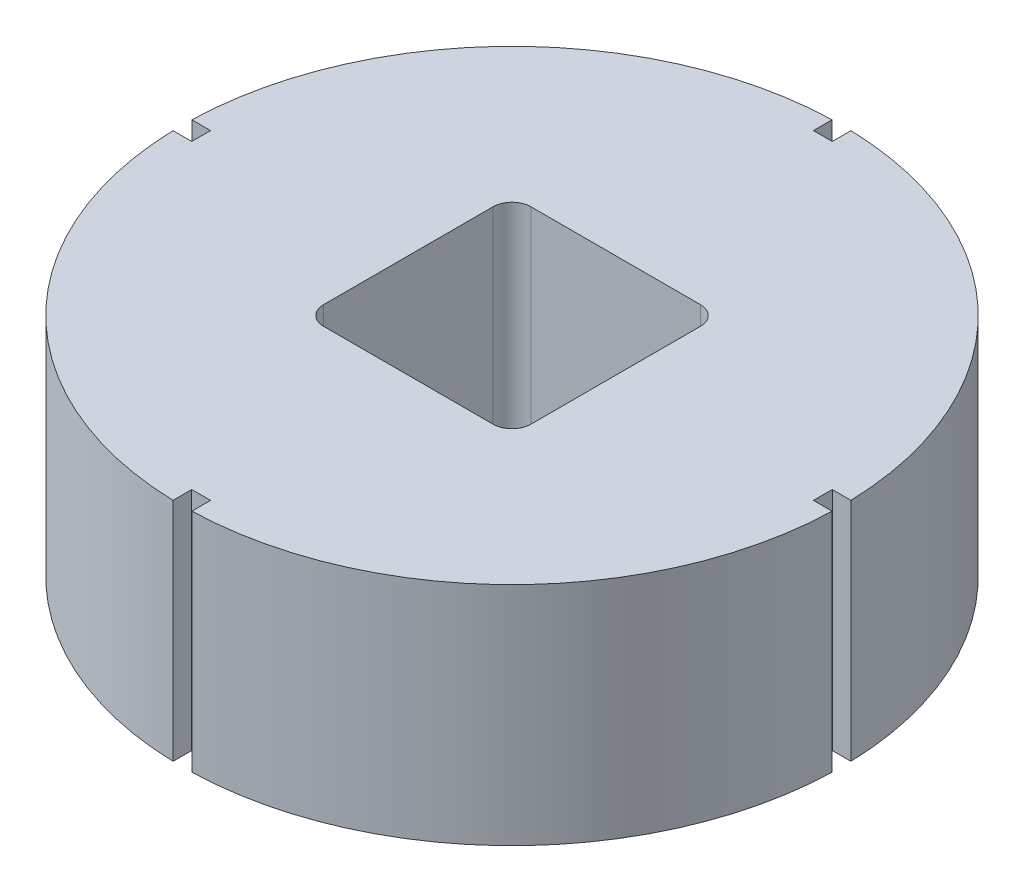
ISO-10303-21;
HEADER;
FILE_DESCRIPTION(('STEP AP214'),'2;1');
FILE_NAME('part.step','',(''),(''),'','','');
FILE_SCHEMA(('AUTOMOTIVE_DESIGN { 1 0 10303 214 1 1 1 1 }'));
ENDSEC;
DATA;
#1=APPLICATION_CONTEXT('core data for automotive mechanical design processes');
#2=APPLICATION_PROTOCOL_DEFINITION('international standard','automotive_design',2000,#1);
#3=PRODUCT_CONTEXT('',#1,'mechanical');
#4=PRODUCT('Part','Part','',(#3));
#5=PRODUCT_RELATED_PRODUCT_CATEGORY('part','',(#4));
#6=PRODUCT_DEFINITION_FORMATION('','',#4);
#7=PRODUCT_DEFINITION_CONTEXT('part definition',#1,'design');
#8=PRODUCT_DEFINITION('design','',#6,#7);
#9=PRODUCT_DEFINITION_SHAPE('','',#8);
#10=(LENGTH_UNIT() NAMED_UNIT(*) SI_UNIT(.MILLI.,.METRE.));
#11=(NAMED_UNIT(*) PLANE_ANGLE_UNIT() SI_UNIT($,.RADIAN.));
#12=(NAMED_UNIT(*) SI_UNIT($,.STERADIAN.) SOLID_ANGLE_UNIT());
#13=UNCERTAINTY_MEASURE_WITH_UNIT(LENGTH_MEASURE(1.E-05),#10,'distance_accuracy_value','');
#14=(GEOMETRIC_REPRESENTATION_CONTEXT(3) GLOBAL_UNCERTAINTY_ASSIGNED_CONTEXT((#13)) GLOBAL_UNIT_ASSIGNED_CONTEXT((#10,
#11,#12)) REPRESENTATION_CONTEXT('',''));
#15=CARTESIAN_POINT('',(0.,0.,0.));
#16=DIRECTION('',(0.,0.,1.));
#17=DIRECTION('',(1.,0.,0.));
#18=AXIS2_PLACEMENT_3D('',#15,#16,#17);
#19=CARTESIAN_POINT('',(0.,24.,0.));
#20=DIRECTION('',(0.,-1.,0.));
#21=DIRECTION('',(0.,0.,-1.));
#22=AXIS2_PLACEMENT_3D('',#19,#20,#21);
#23=CYLINDRICAL_SURFACE('',#22,35.);
#24=CARTESIAN_POINT('',(0.,0.,0.));
#25=DIRECTION('',(0.,1.,0.));
#26=DIRECTION('',(0.,0.,1.));
#27=AXIS2_PLACEMENT_3D('',#24,#25,#26);
#28=CIRCLE('',#27,35.);
#29=CARTESIAN_POINT('',(34.9857113690718,0.,-1.));
#30=VERTEX_POINT('',#29);
#31=CARTESIAN_POINT('',(1.,0.,-34.9857113690718));
#32=VERTEX_POINT('',#31);
#33=EDGE_CURVE('E454',#30,#32,#28,.T.);
#34=ORIENTED_EDGE('',*,*,#33,.T.);
#35=DIRECTION('',(0.,1.,0.));
#36=VECTOR('',#35,1.);
#37=CARTESIAN_POINT('',(1.,-12.,-34.9857113690718));
#38=LINE('',#37,#36);
#39=CARTESIAN_POINT('',(1.,24.,-34.9857113690718));
#40=VERTEX_POINT('',#39);
#41=EDGE_CURVE('E317',#32,#40,#38,.T.);
#42=ORIENTED_EDGE('',*,*,#41,.T.);
#43=CARTESIAN_POINT('',(0.,24.,0.));
#44=DIRECTION('',(0.,1.,0.));
#45=DIRECTION('',(0.,0.,1.));
#46=AXIS2_PLACEMENT_3D('',#43,#44,#45);
#47=CIRCLE('',#46,35.);
#48=CARTESIAN_POINT('',(34.9857113690718,24.,-1.));
#49=VERTEX_POINT('',#48);
#50=EDGE_CURVE('E227',#49,#40,#47,.T.);
#51=ORIENTED_EDGE('',*,*,#50,.F.);
#52=DIRECTION('',(0.,1.,0.));
#53=VECTOR('',#52,1.);
#54=CARTESIAN_POINT('',(34.9857113690718,-12.,-1.));
#55=LINE('',#54,#53);
#56=EDGE_CURVE('E333',#30,#49,#55,.T.);
#57=ORIENTED_EDGE('',*,*,#56,.F.);
#58=EDGE_LOOP('',(#34,#42,#51,#57));
#59=FACE_BOUND('',#58,.T.);
#60=ADVANCED_FACE('F41',(#59),#23,.T.);
#61=CARTESIAN_POINT('',(1.00000000000001,0.,34.9857113690718));
#62=VERTEX_POINT('',#61);
#63=CARTESIAN_POINT('',(34.9857113690718,0.,0.999999999999998));
#64=VERTEX_POINT('',#63);
#65=EDGE_CURVE('E233',#62,#64,#28,.T.);
#66=ORIENTED_EDGE('',*,*,#65,.T.);
#67=DIRECTION('',(0.,1.,0.));
#68=VECTOR('',#67,1.);
#69=CARTESIAN_POINT('',(34.9857113690718,-12.,0.999999999999998));
#70=LINE('',#69,#68);
#71=CARTESIAN_POINT('',(34.9857113690718,24.,0.999999999999998));
#72=VERTEX_POINT('',#71);
#73=EDGE_CURVE('E222',#64,#72,#70,.T.);
#74=ORIENTED_EDGE('',*,*,#73,.T.);
#75=CARTESIAN_POINT('',(1.00000000000001,24.,34.9857113690718));
#76=VERTEX_POINT('',#75);
#77=EDGE_CURVE('E231',#76,#72,#47,.T.);
#78=ORIENTED_EDGE('',*,*,#77,.F.);
#79=DIRECTION('',(0.,1.,0.));
#80=VECTOR('',#79,1.);
#81=CARTESIAN_POINT('',(1.00000000000001,-12.,34.9857113690718));
#82=LINE('',#81,#80);
#83=EDGE_CURVE('E348',#62,#76,#82,.T.);
#84=ORIENTED_EDGE('',*,*,#83,.F.);
#85=EDGE_LOOP('',(#66,#74,#78,#84));
#86=FACE_BOUND('',#85,.T.);
#87=ADVANCED_FACE('F430',(#86),#23,.T.);
#88=CARTESIAN_POINT('',(-34.9857113690718,0.,1.00000000000001));
#89=VERTEX_POINT('',#88);
#90=CARTESIAN_POINT('',(-0.999999999999996,0.,34.9857113690718));
#91=VERTEX_POINT('',#90);
#92=EDGE_CURVE('E320',#89,#91,#28,.T.);
#93=ORIENTED_EDGE('',*,*,#92,.T.);
#94=DIRECTION('',(0.,1.,0.));
#95=VECTOR('',#94,1.);
#96=CARTESIAN_POINT('',(-0.999999999999996,-12.,34.9857113690718));
#97=LINE('',#96,#95);
#98=CARTESIAN_POINT('',(-0.999999999999996,24.,34.9857113690718));
#99=VERTEX_POINT('',#98);
#100=EDGE_CURVE('E328',#91,#99,#97,.T.);
#101=ORIENTED_EDGE('',*,*,#100,.T.);
#102=CARTESIAN_POINT('',(-34.9857113690718,24.,1.00000000000001));
#103=VERTEX_POINT('',#102);
#104=EDGE_CURVE('E228',#103,#99,#47,.T.);
#105=ORIENTED_EDGE('',*,*,#104,.F.);
#106=DIRECTION('',(0.,1.,0.));
#107=VECTOR('',#106,1.);
#108=CARTESIAN_POINT('',(-34.9857113690718,-12.,1.00000000000001));
#109=LINE('',#108,#107);
#110=EDGE_CURVE('E364',#89,#103,#109,.T.);
#111=ORIENTED_EDGE('',*,*,#110,.F.);
#112=EDGE_LOOP('',(#93,#101,#105,#111));
#113=FACE_BOUND('',#112,.T.);
#114=ADVANCED_FACE('F436',(#113),#23,.T.);
#115=CARTESIAN_POINT('',(-1.,24.,-34.9857113690718));
#116=VERTEX_POINT('',#115);
#117=CARTESIAN_POINT('',(-34.9857113690718,24.,-0.999999999999994));
#118=VERTEX_POINT('',#117);
#119=EDGE_CURVE('E219',#116,#118,#47,.T.);
#120=ORIENTED_EDGE('',*,*,#119,.F.);
#121=DIRECTION('',(0.,1.,0.));
#122=VECTOR('',#121,1.);
#123=CARTESIAN_POINT('',(-1.,-12.,-34.9857113690718));
#124=LINE('',#123,#122);
#125=CARTESIAN_POINT('',(-1.,0.,-34.9857113690718));
#126=VERTEX_POINT('',#125);
#127=EDGE_CURVE('E200',#126,#116,#124,.T.);
#128=ORIENTED_EDGE('',*,*,#127,.F.);
#129=CARTESIAN_POINT('',(-34.9857113690718,0.,-0.999999999999994));
#130=VERTEX_POINT('',#129);
#131=EDGE_CURVE('E453',#126,#130,#28,.T.);
#132=ORIENTED_EDGE('',*,*,#131,.T.);
#133=DIRECTION('',(0.,1.,0.));
#134=VECTOR('',#133,1.);
#135=CARTESIAN_POINT('',(-34.9857113690718,-12.,-0.999999999999994));
#136=LINE('',#135,#134);
#137=EDGE_CURVE('E226',#130,#118,#136,.T.);
#138=ORIENTED_EDGE('',*,*,#137,.T.);
#139=EDGE_LOOP('',(#120,#128,#132,#138));
#140=FACE_BOUND('',#139,.T.);
#141=ADVANCED_FACE('F225',(#140),#23,.T.);
#142=CARTESIAN_POINT('',(0.,24.,0.));
#143=DIRECTION('',(0.,1.,0.));
#144=DIRECTION('',(0.,0.,1.));
#145=AXIS2_PLACEMENT_3D('',#142,#143,#144);
#146=PLANE('',#145);
#147=DIRECTION('',(0.,0.,-1.));
#148=VECTOR('',#147,1.);
#149=CARTESIAN_POINT('',(1.,24.,-33.));
#150=LINE('',#149,#148);
#151=CARTESIAN_POINT('',(1.,24.,-33.));
#152=VERTEX_POINT('',#151);
#153=EDGE_CURVE('E211',#152,#40,#150,.T.);
#154=ORIENTED_EDGE('',*,*,#153,.F.);
#155=DIRECTION('',(1.,0.,0.));
#156=VECTOR('',#155,1.);
#157=CARTESIAN_POINT('',(-1.,24.,-33.));
#158=LINE('',#157,#156);
#159=CARTESIAN_POINT('',(-1.,24.,-33.));
#160=VERTEX_POINT('',#159);
#161=EDGE_CURVE('E221',#160,#152,#158,.T.);
#162=ORIENTED_EDGE('',*,*,#161,.F.);
#163=DIRECTION('',(0.,0.,1.));
#164=VECTOR('',#163,1.);
#165=CARTESIAN_POINT('',(-1.,24.,-34.9857113690718));
#166=LINE('',#165,#164);
#167=EDGE_CURVE('E203',#116,#160,#166,.T.);
#168=ORIENTED_EDGE('',*,*,#167,.F.);
#169=ORIENTED_EDGE('',*,*,#119,.T.);
#170=DIRECTION('',(-1.,0.,0.));
#171=VECTOR('',#170,1.);
#172=CARTESIAN_POINT('',(-33.,24.,-0.999999999999994));
#173=LINE('',#172,#171);
#174=CARTESIAN_POINT('',(-33.,24.,-0.999999999999994));
#175=VERTEX_POINT('',#174);
#176=EDGE_CURVE('E362',#175,#118,#173,.T.);
#177=ORIENTED_EDGE('',*,*,#176,.F.);
#178=DIRECTION('',(0.,0.,-1.));
#179=VECTOR('',#178,1.);
#180=CARTESIAN_POINT('',(-33.,24.,1.00000000000001));
#181=LINE('',#180,#179);
#182=CARTESIAN_POINT('',(-33.,24.,1.00000000000001));
#183=VERTEX_POINT('',#182);
#184=EDGE_CURVE('E359',#183,#175,#181,.T.);
#185=ORIENTED_EDGE('',*,*,#184,.F.);
#186=DIRECTION('',(1.,0.,0.));
#187=VECTOR('',#186,1.);
#188=CARTESIAN_POINT('',(-34.9857113690718,24.,1.00000000000001));
#189=LINE('',#188,#187);
#190=EDGE_CURVE('E356',#103,#183,#189,.T.);
#191=ORIENTED_EDGE('',*,*,#190,.F.);
#192=ORIENTED_EDGE('',*,*,#104,.T.);
#193=DIRECTION('',(0.,0.,1.));
#194=VECTOR('',#193,1.);
#195=CARTESIAN_POINT('',(-0.999999999999996,24.,33.));
#196=LINE('',#195,#194);
#197=CARTESIAN_POINT('',(-0.999999999999996,24.,33.));
#198=VERTEX_POINT('',#197);
#199=EDGE_CURVE('E346',#198,#99,#196,.T.);
#200=ORIENTED_EDGE('',*,*,#199,.F.);
#201=DIRECTION('',(-1.,0.,0.));
#202=VECTOR('',#201,1.);
#203=CARTESIAN_POINT('',(1.00000000000001,24.,33.));
#204=LINE('',#203,#202);
#205=CARTESIAN_POINT('',(1.00000000000001,24.,33.));
#206=VERTEX_POINT('',#205);
#207=EDGE_CURVE('E343',#206,#198,#204,.T.);
#208=ORIENTED_EDGE('',*,*,#207,.F.);
#209=DIRECTION('',(0.,0.,-1.));
#210=VECTOR('',#209,1.);
#211=CARTESIAN_POINT('',(1.00000000000001,24.,34.9857113690718));
#212=LINE('',#211,#210);
#213=EDGE_CURVE('E340',#76,#206,#212,.T.);
#214=ORIENTED_EDGE('',*,*,#213,.F.);
#215=ORIENTED_EDGE('',*,*,#77,.T.);
#216=DIRECTION('',(1.,0.,0.));
#217=VECTOR('',#216,1.);
#218=CARTESIAN_POINT('',(33.,24.,0.999999999999998));
#219=LINE('',#218,#217);
#220=CARTESIAN_POINT('',(33.,24.,0.999999999999998));
#221=VERTEX_POINT('',#220);
#222=EDGE_CURVE('E331',#221,#72,#219,.T.);
#223=ORIENTED_EDGE('',*,*,#222,.F.);
#224=DIRECTION('',(0.,0.,1.));
#225=VECTOR('',#224,1.);
#226=CARTESIAN_POINT('',(33.,24.,-1.));
#227=LINE('',#226,#225);
#228=CARTESIAN_POINT('',(33.,24.,-1.));
#229=VERTEX_POINT('',#228);
#230=EDGE_CURVE('E327',#229,#221,#227,.T.);
#231=ORIENTED_EDGE('',*,*,#230,.F.);
#232=DIRECTION('',(-1.,0.,0.));
#233=VECTOR('',#232,1.);
#234=CARTESIAN_POINT('',(34.9857113690718,24.,-1.));
#235=LINE('',#234,#233);
#236=EDGE_CURVE('E325',#49,#229,#235,.T.);
#237=ORIENTED_EDGE('',*,*,#236,.F.);
#238=ORIENTED_EDGE('',*,*,#50,.T.);
#239=EDGE_LOOP('',(#154,#162,#168,#169,#177,#185,#191,#192,#200,#208,#214,#215,#223,#231,#237,#238));
#240=FACE_BOUND('',#239,.T.);
#241=CARTESIAN_POINT('',(-9.,24.,9.));
#242=DIRECTION('',(0.,1.,0.));
#243=DIRECTION('',(0.,0.,1.));
#244=AXIS2_PLACEMENT_3D('',#241,#242,#243);
#245=CIRCLE('',#244,2.);
#246=CARTESIAN_POINT('',(-11.,24.,8.99999999999999));
#247=VERTEX_POINT('',#246);
#248=CARTESIAN_POINT('',(-8.99999999999998,24.,11.));
#249=VERTEX_POINT('',#248);
#250=EDGE_CURVE('E261',#247,#249,#245,.T.);
#251=ORIENTED_EDGE('',*,*,#250,.F.);
#252=DIRECTION('',(0.,0.,1.));
#253=VECTOR('',#252,1.);
#254=CARTESIAN_POINT('',(-11.,24.,-8.99999999999998));
#255=LINE('',#254,#253);
#256=CARTESIAN_POINT('',(-11.,24.,-8.99999999999998));
#257=VERTEX_POINT('',#256);
#258=EDGE_CURVE('E258',#257,#247,#255,.T.);
#259=ORIENTED_EDGE('',*,*,#258,.F.);
#260=CARTESIAN_POINT('',(-9.,24.,-9.));
#261=DIRECTION('',(0.,1.,0.));
#262=DIRECTION('',(0.,0.,1.));
#263=AXIS2_PLACEMENT_3D('',#260,#261,#262);
#264=CIRCLE('',#263,2.);
#265=CARTESIAN_POINT('',(-8.99999999999999,24.,-11.));
#266=VERTEX_POINT('',#265);
#267=EDGE_CURVE('E255',#266,#257,#264,.T.);
#268=ORIENTED_EDGE('',*,*,#267,.F.);
#269=DIRECTION('',(-1.,0.,0.));
#270=VECTOR('',#269,1.);
#271=CARTESIAN_POINT('',(-8.99999999999999,24.,-11.));
#272=LINE('',#271,#270);
#273=CARTESIAN_POINT('',(8.99999999999998,24.,-11.));
#274=VERTEX_POINT('',#273);
#275=EDGE_CURVE('E252',#274,#266,#272,.T.);
#276=ORIENTED_EDGE('',*,*,#275,.F.);
#277=CARTESIAN_POINT('',(9.,24.,-9.));
#278=DIRECTION('',(0.,1.,0.));
#279=DIRECTION('',(0.,0.,-1.));
#280=AXIS2_PLACEMENT_3D('',#277,#278,#279);
#281=CIRCLE('',#280,2.);
#282=CARTESIAN_POINT('',(11.,24.,-8.99999999999998));
#283=VERTEX_POINT('',#282);
#284=EDGE_CURVE('E249',#283,#274,#281,.T.);
#285=ORIENTED_EDGE('',*,*,#284,.F.);
#286=DIRECTION('',(0.,0.,-1.));
#287=VECTOR('',#286,1.);
#288=CARTESIAN_POINT('',(11.,24.,-8.99999999999998));
#289=LINE('',#288,#287);
#290=CARTESIAN_POINT('',(11.,24.,8.99999999999999));
#291=VERTEX_POINT('',#290);
#292=EDGE_CURVE('E246',#291,#283,#289,.T.);
#293=ORIENTED_EDGE('',*,*,#292,.F.);
#294=CARTESIAN_POINT('',(9.,24.,9.));
#295=DIRECTION('',(0.,1.,0.));
#296=DIRECTION('',(0.,0.,1.));
#297=AXIS2_PLACEMENT_3D('',#294,#295,#296);
#298=CIRCLE('',#297,2.);
#299=CARTESIAN_POINT('',(8.99999999999999,24.,11.));
#300=VERTEX_POINT('',#299);
#301=EDGE_CURVE('E243',#300,#291,#298,.T.);
#302=ORIENTED_EDGE('',*,*,#301,.F.);
#303=DIRECTION('',(1.,0.,0.));
#304=VECTOR('',#303,1.);
#305=CARTESIAN_POINT('',(-8.99999999999998,24.,11.));
#306=LINE('',#305,#304);
#307=EDGE_CURVE('E242',#249,#300,#306,.T.);
#308=ORIENTED_EDGE('',*,*,#307,.F.);
#309=EDGE_LOOP('',(#251,#259,#268,#276,#285,#293,#302,#308));
#310=FACE_BOUND('',#309,.T.);
#311=ADVANCED_FACE('F216',(#240,#310),#146,.T.);
#312=CARTESIAN_POINT('',(0.,0.,0.));
#313=DIRECTION('',(0.,1.,0.));
#314=DIRECTION('',(0.,0.,1.));
#315=AXIS2_PLACEMENT_3D('',#312,#313,#314);
#316=PLANE('',#315);
#317=DIRECTION('',(0.,0.,1.));
#318=VECTOR('',#317,1.);
#319=CARTESIAN_POINT('',(-11.,0.,0.));
#320=LINE('',#319,#318);
#321=CARTESIAN_POINT('',(-11.,0.,-8.99999999999998));
#322=VERTEX_POINT('',#321);
#323=CARTESIAN_POINT('',(-11.,0.,8.99999999999999));
#324=VERTEX_POINT('',#323);
#325=EDGE_CURVE('E237',#322,#324,#320,.T.);
#326=ORIENTED_EDGE('',*,*,#325,.T.);
#327=CARTESIAN_POINT('',(-9.,0.,9.));
#328=DIRECTION('',(0.,1.,0.));
#329=DIRECTION('',(0.,0.,1.));
#330=AXIS2_PLACEMENT_3D('',#327,#328,#329);
#331=CIRCLE('',#330,2.);
#332=CARTESIAN_POINT('',(-8.99999999999998,0.,11.));
#333=VERTEX_POINT('',#332);
#334=EDGE_CURVE('E371',#324,#333,#331,.T.);
#335=ORIENTED_EDGE('',*,*,#334,.T.);
#336=DIRECTION('',(1.,0.,0.));
#337=VECTOR('',#336,1.);
#338=CARTESIAN_POINT('',(0.,0.,11.));
#339=LINE('',#338,#337);
#340=CARTESIAN_POINT('',(8.99999999999999,0.,11.));
#341=VERTEX_POINT('',#340);
#342=EDGE_CURVE('E374',#333,#341,#339,.T.);
#343=ORIENTED_EDGE('',*,*,#342,.T.);
#344=CARTESIAN_POINT('',(9.,0.,9.));
#345=DIRECTION('',(0.,1.,0.));
#346=DIRECTION('',(0.,0.,1.));
#347=AXIS2_PLACEMENT_3D('',#344,#345,#346);
#348=CIRCLE('',#347,2.);
#349=CARTESIAN_POINT('',(11.,0.,8.99999999999999));
#350=VERTEX_POINT('',#349);
#351=EDGE_CURVE('E388',#341,#350,#348,.T.);
#352=ORIENTED_EDGE('',*,*,#351,.T.);
#353=DIRECTION('',(0.,0.,-1.));
#354=VECTOR('',#353,1.);
#355=CARTESIAN_POINT('',(11.,0.,0.));
#356=LINE('',#355,#354);
#357=CARTESIAN_POINT('',(11.,0.,-8.99999999999998));
#358=VERTEX_POINT('',#357);
#359=EDGE_CURVE('E385',#350,#358,#356,.T.);
#360=ORIENTED_EDGE('',*,*,#359,.T.);
#361=CARTESIAN_POINT('',(9.,0.,-9.));
#362=DIRECTION('',(0.,1.,0.));
#363=DIRECTION('',(0.,0.,1.));
#364=AXIS2_PLACEMENT_3D('',#361,#362,#363);
#365=CIRCLE('',#364,2.);
#366=CARTESIAN_POINT('',(8.99999999999998,0.,-11.));
#367=VERTEX_POINT('',#366);
#368=EDGE_CURVE('E382',#358,#367,#365,.T.);
#369=ORIENTED_EDGE('',*,*,#368,.T.);
#370=DIRECTION('',(-1.,0.,0.));
#371=VECTOR('',#370,1.);
#372=CARTESIAN_POINT('',(0.,0.,-11.));
#373=LINE('',#372,#371);
#374=CARTESIAN_POINT('',(-8.99999999999999,0.,-11.));
#375=VERTEX_POINT('',#374);
#376=EDGE_CURVE('E379',#367,#375,#373,.T.);
#377=ORIENTED_EDGE('',*,*,#376,.T.);
#378=CARTESIAN_POINT('',(-9.,0.,-9.));
#379=DIRECTION('',(0.,1.,0.));
#380=DIRECTION('',(0.,0.,1.));
#381=AXIS2_PLACEMENT_3D('',#378,#379,#380);
#382=CIRCLE('',#381,2.);
#383=EDGE_CURVE('E264',#375,#322,#382,.T.);
#384=ORIENTED_EDGE('',*,*,#383,.T.);
#385=EDGE_LOOP('',(#326,#335,#343,#352,#360,#369,#377,#384));
#386=FACE_BOUND('',#385,.T.);
#387=DIRECTION('',(1.,0.,0.));
#388=VECTOR('',#387,1.);
#389=CARTESIAN_POINT('',(0.,0.,-33.));
#390=LINE('',#389,#388);
#391=CARTESIAN_POINT('',(-1.,0.,-33.));
#392=VERTEX_POINT('',#391);
#393=CARTESIAN_POINT('',(1.,0.,-33.));
#394=VERTEX_POINT('',#393);
#395=EDGE_CURVE('E49',#392,#394,#390,.T.);
#396=ORIENTED_EDGE('',*,*,#395,.T.);
#397=DIRECTION('',(0.,0.,-1.));
#398=VECTOR('',#397,1.);
#399=CARTESIAN_POINT('',(0.999999999999997,0.,0.));
#400=LINE('',#399,#398);
#401=EDGE_CURVE('E12',#394,#32,#400,.T.);
#402=ORIENTED_EDGE('',*,*,#401,.T.);
#403=ORIENTED_EDGE('',*,*,#33,.F.);
#404=DIRECTION('',(-1.,0.,0.));
#405=VECTOR('',#404,1.);
#406=CARTESIAN_POINT('',(0.,0.,-0.999999999999993));
#407=LINE('',#406,#405);
#408=CARTESIAN_POINT('',(33.,0.,-1.));
#409=VERTEX_POINT('',#408);
#410=EDGE_CURVE('E298',#30,#409,#407,.T.);
#411=ORIENTED_EDGE('',*,*,#410,.T.);
#412=DIRECTION('',(0.,0.,1.));
#413=VECTOR('',#412,1.);
#414=CARTESIAN_POINT('',(33.,0.,0.));
#415=LINE('',#414,#413);
#416=CARTESIAN_POINT('',(33.,0.,0.999999999999998));
#417=VERTEX_POINT('',#416);
#418=EDGE_CURVE('E301',#409,#417,#415,.T.);
#419=ORIENTED_EDGE('',*,*,#418,.T.);
#420=DIRECTION('',(1.,0.,0.));
#421=VECTOR('',#420,1.);
#422=CARTESIAN_POINT('',(0.,0.,0.999999999999998));
#423=LINE('',#422,#421);
#424=EDGE_CURVE('E304',#417,#64,#423,.T.);
#425=ORIENTED_EDGE('',*,*,#424,.T.);
#426=ORIENTED_EDGE('',*,*,#65,.F.);
#427=DIRECTION('',(0.,0.,-1.));
#428=VECTOR('',#427,1.);
#429=CARTESIAN_POINT('',(0.999999999999995,0.,0.));
#430=LINE('',#429,#428);
#431=CARTESIAN_POINT('',(1.00000000000001,0.,33.));
#432=VERTEX_POINT('',#431);
#433=EDGE_CURVE('E289',#62,#432,#430,.T.);
#434=ORIENTED_EDGE('',*,*,#433,.T.);
#435=DIRECTION('',(-1.,0.,0.));
#436=VECTOR('',#435,1.);
#437=CARTESIAN_POINT('',(0.,0.,33.));
#438=LINE('',#437,#436);
#439=CARTESIAN_POINT('',(-0.999999999999996,0.,33.));
#440=VERTEX_POINT('',#439);
#441=EDGE_CURVE('E292',#432,#440,#438,.T.);
#442=ORIENTED_EDGE('',*,*,#441,.T.);
#443=DIRECTION('',(0.,0.,1.));
#444=VECTOR('',#443,1.);
#445=CARTESIAN_POINT('',(-0.999999999999996,0.,0.));
#446=LINE('',#445,#444);
#447=EDGE_CURVE('E295',#440,#91,#446,.T.);
#448=ORIENTED_EDGE('',*,*,#447,.T.);
#449=ORIENTED_EDGE('',*,*,#92,.F.);
#450=DIRECTION('',(1.,0.,0.));
#451=VECTOR('',#450,1.);
#452=CARTESIAN_POINT('',(0.,0.,0.999999999999993));
#453=LINE('',#452,#451);
#454=CARTESIAN_POINT('',(-33.,0.,1.00000000000001));
#455=VERTEX_POINT('',#454);
#456=EDGE_CURVE('E279',#89,#455,#453,.T.);
#457=ORIENTED_EDGE('',*,*,#456,.T.);
#458=DIRECTION('',(0.,0.,-1.));
#459=VECTOR('',#458,1.);
#460=CARTESIAN_POINT('',(-33.,0.,0.));
#461=LINE('',#460,#459);
#462=CARTESIAN_POINT('',(-33.,0.,-0.999999999999994));
#463=VERTEX_POINT('',#462);
#464=EDGE_CURVE('E283',#455,#463,#461,.T.);
#465=ORIENTED_EDGE('',*,*,#464,.T.);
#466=DIRECTION('',(-1.,0.,0.));
#467=VECTOR('',#466,1.);
#468=CARTESIAN_POINT('',(0.,0.,-0.999999999999998));
#469=LINE('',#468,#467);
#470=EDGE_CURVE('E286',#463,#130,#469,.T.);
#471=ORIENTED_EDGE('',*,*,#470,.T.);
#472=ORIENTED_EDGE('',*,*,#131,.F.);
#473=DIRECTION('',(0.,0.,1.));
#474=VECTOR('',#473,1.);
#475=CARTESIAN_POINT('',(-0.999999999999994,0.,0.));
#476=LINE('',#475,#474);
#477=EDGE_CURVE('E206',#126,#392,#476,.T.);
#478=ORIENTED_EDGE('',*,*,#477,.T.);
#479=EDGE_LOOP('',(#396,#402,#403,#411,#419,#425,#426,#434,#442,#448,#449,#457,#465,#471,#472,#478));
#480=FACE_BOUND('',#479,.T.);
#481=ADVANCED_FACE('F309',(#386,#480),#316,.F.);
#482=CARTESIAN_POINT('',(-9.,-1.,9.));
#483=DIRECTION('',(0.,1.,0.));
#484=DIRECTION('',(0.,0.,1.));
#485=AXIS2_PLACEMENT_3D('',#482,#483,#484);
#486=CYLINDRICAL_SURFACE('',#485,2.);
#487=DIRECTION('',(0.,1.,0.));
#488=VECTOR('',#487,1.);
#489=CARTESIAN_POINT('',(-11.,-1.,8.99999999999999));
#490=LINE('',#489,#488);
#491=EDGE_CURVE('E262',#324,#247,#490,.T.);
#492=ORIENTED_EDGE('',*,*,#491,.T.);
#493=ORIENTED_EDGE('',*,*,#250,.T.);
#494=DIRECTION('',(0.,1.,0.));
#495=VECTOR('',#494,1.);
#496=CARTESIAN_POINT('',(-8.99999999999998,-1.,11.));
#497=LINE('',#496,#495);
#498=EDGE_CURVE('E239',#333,#249,#497,.T.);
#499=ORIENTED_EDGE('',*,*,#498,.F.);
#500=ORIENTED_EDGE('',*,*,#334,.F.);
#501=EDGE_LOOP('',(#492,#493,#499,#500));
#502=FACE_BOUND('',#501,.T.);
#503=ADVANCED_FACE('F398',(#502),#486,.F.);
#504=CARTESIAN_POINT('',(-11.,-1.,-8.99999999999998));
#505=DIRECTION('',(-1.,0.,0.));
#506=DIRECTION('',(0.,0.,1.));
#507=AXIS2_PLACEMENT_3D('',#504,#505,#506);
#508=PLANE('',#507);
#509=DIRECTION('',(0.,1.,0.));
#510=VECTOR('',#509,1.);
#511=CARTESIAN_POINT('',(-11.,-1.,-8.99999999999998));
#512=LINE('',#511,#510);
#513=EDGE_CURVE('E259',#322,#257,#512,.T.);
#514=ORIENTED_EDGE('',*,*,#513,.T.);
#515=ORIENTED_EDGE('',*,*,#258,.T.);
#516=ORIENTED_EDGE('',*,*,#491,.F.);
#517=ORIENTED_EDGE('',*,*,#325,.F.);
#518=EDGE_LOOP('',(#514,#515,#516,#517));
#519=FACE_BOUND('',#518,.T.);
#520=ADVANCED_FACE('F43',(#519),#508,.F.);
#521=CARTESIAN_POINT('',(-9.,-1.,-9.));
#522=DIRECTION('',(0.,1.,0.));
#523=DIRECTION('',(0.,0.,1.));
#524=AXIS2_PLACEMENT_3D('',#521,#522,#523);
#525=CYLINDRICAL_SURFACE('',#524,2.);
#526=DIRECTION('',(0.,1.,0.));
#527=VECTOR('',#526,1.);
#528=CARTESIAN_POINT('',(-8.99999999999999,-1.,-11.));
#529=LINE('',#528,#527);
#530=EDGE_CURVE('E256',#375,#266,#529,.T.);
#531=ORIENTED_EDGE('',*,*,#530,.T.);
#532=ORIENTED_EDGE('',*,*,#267,.T.);
#533=ORIENTED_EDGE('',*,*,#513,.F.);
#534=ORIENTED_EDGE('',*,*,#383,.F.);
#535=EDGE_LOOP('',(#531,#532,#533,#534));
#536=FACE_BOUND('',#535,.T.);
#537=ADVANCED_FACE('F420',(#536),#525,.F.);
#538=CARTESIAN_POINT('',(-8.99999999999999,-1.,-11.));
#539=DIRECTION('',(0.,0.,-1.));
#540=DIRECTION('',(-1.,0.,0.));
#541=AXIS2_PLACEMENT_3D('',#538,#539,#540);
#542=PLANE('',#541);
#543=DIRECTION('',(0.,1.,0.));
#544=VECTOR('',#543,1.);
#545=CARTESIAN_POINT('',(8.99999999999998,-1.,-11.));
#546=LINE('',#545,#544);
#547=EDGE_CURVE('E253',#367,#274,#546,.T.);
#548=ORIENTED_EDGE('',*,*,#547,.T.);
#549=ORIENTED_EDGE('',*,*,#275,.T.);
#550=ORIENTED_EDGE('',*,*,#530,.F.);
#551=ORIENTED_EDGE('',*,*,#376,.F.);
#552=EDGE_LOOP('',(#548,#549,#550,#551));
#553=FACE_BOUND('',#552,.T.);
#554=ADVANCED_FACE('F417',(#553),#542,.F.);
#555=CARTESIAN_POINT('',(9.,-1.,-9.));
#556=DIRECTION('',(0.,1.,0.));
#557=DIRECTION('',(0.,0.,1.));
#558=AXIS2_PLACEMENT_3D('',#555,#556,#557);
#559=CYLINDRICAL_SURFACE('',#558,2.);
#560=DIRECTION('',(0.,1.,0.));
#561=VECTOR('',#560,1.);
#562=CARTESIAN_POINT('',(11.,-1.,-8.99999999999998));
#563=LINE('',#562,#561);
#564=EDGE_CURVE('E250',#358,#283,#563,.T.);
#565=ORIENTED_EDGE('',*,*,#564,.T.);
#566=ORIENTED_EDGE('',*,*,#284,.T.);
#567=ORIENTED_EDGE('',*,*,#547,.F.);
#568=ORIENTED_EDGE('',*,*,#368,.F.);
#569=EDGE_LOOP('',(#565,#566,#567,#568));
#570=FACE_BOUND('',#569,.T.);
#571=ADVANCED_FACE('F414',(#570),#559,.F.);
#572=CARTESIAN_POINT('',(11.,-1.,-8.99999999999998));
#573=DIRECTION('',(1.,0.,0.));
#574=DIRECTION('',(0.,0.,-1.));
#575=AXIS2_PLACEMENT_3D('',#572,#573,#574);
#576=PLANE('',#575);
#577=DIRECTION('',(0.,1.,0.));
#578=VECTOR('',#577,1.);
#579=CARTESIAN_POINT('',(11.,-1.,8.99999999999999));
#580=LINE('',#579,#578);
#581=EDGE_CURVE('E247',#350,#291,#580,.T.);
#582=ORIENTED_EDGE('',*,*,#581,.T.);
#583=ORIENTED_EDGE('',*,*,#292,.T.);
#584=ORIENTED_EDGE('',*,*,#564,.F.);
#585=ORIENTED_EDGE('',*,*,#359,.F.);
#586=EDGE_LOOP('',(#582,#583,#584,#585));
#587=FACE_BOUND('',#586,.T.);
#588=ADVANCED_FACE('F410',(#587),#576,.F.);
#589=CARTESIAN_POINT('',(9.,-1.,9.));
#590=DIRECTION('',(0.,1.,0.));
#591=DIRECTION('',(0.,0.,1.));
#592=AXIS2_PLACEMENT_3D('',#589,#590,#591);
#593=CYLINDRICAL_SURFACE('',#592,2.);
#594=DIRECTION('',(0.,1.,0.));
#595=VECTOR('',#594,1.);
#596=CARTESIAN_POINT('',(8.99999999999999,-1.,11.));
#597=LINE('',#596,#595);
#598=EDGE_CURVE('E244',#341,#300,#597,.T.);
#599=ORIENTED_EDGE('',*,*,#598,.T.);
#600=ORIENTED_EDGE('',*,*,#301,.T.);
#601=ORIENTED_EDGE('',*,*,#581,.F.);
#602=ORIENTED_EDGE('',*,*,#351,.F.);
#603=EDGE_LOOP('',(#599,#600,#601,#602));
#604=FACE_BOUND('',#603,.T.);
#605=ADVANCED_FACE('F408',(#604),#593,.F.);
#606=CARTESIAN_POINT('',(-8.99999999999998,-1.,11.));
#607=DIRECTION('',(0.,0.,1.));
#608=DIRECTION('',(1.,0.,0.));
#609=AXIS2_PLACEMENT_3D('',#606,#607,#608);
#610=PLANE('',#609);
#611=ORIENTED_EDGE('',*,*,#498,.T.);
#612=ORIENTED_EDGE('',*,*,#307,.T.);
#613=ORIENTED_EDGE('',*,*,#598,.F.);
#614=ORIENTED_EDGE('',*,*,#342,.F.);
#615=EDGE_LOOP('',(#611,#612,#613,#614));
#616=FACE_BOUND('',#615,.T.);
#617=ADVANCED_FACE('F395',(#616),#610,.F.);
#618=CARTESIAN_POINT('',(-33.,-12.,-0.999999999999994));
#619=DIRECTION('',(0.,0.,-1.));
#620=DIRECTION('',(-1.,0.,0.));
#621=AXIS2_PLACEMENT_3D('',#618,#619,#620);
#622=PLANE('',#621);
#623=DIRECTION('',(0.,1.,0.));
#624=VECTOR('',#623,1.);
#625=CARTESIAN_POINT('',(-33.,-12.,-0.999999999999994));
#626=LINE('',#625,#624);
#627=EDGE_CURVE('E366',#463,#175,#626,.T.);
#628=ORIENTED_EDGE('',*,*,#627,.T.);
#629=ORIENTED_EDGE('',*,*,#176,.T.);
#630=ORIENTED_EDGE('',*,*,#137,.F.);
#631=ORIENTED_EDGE('',*,*,#470,.F.);
#632=EDGE_LOOP('',(#628,#629,#630,#631));
#633=FACE_BOUND('',#632,.T.);
#634=ADVANCED_FACE('F496',(#633),#622,.F.);
#635=CARTESIAN_POINT('',(-33.,-12.,1.00000000000001));
#636=DIRECTION('',(1.,0.,0.));
#637=DIRECTION('',(0.,0.,-1.));
#638=AXIS2_PLACEMENT_3D('',#635,#636,#637);
#639=PLANE('',#638);
#640=DIRECTION('',(0.,1.,0.));
#641=VECTOR('',#640,1.);
#642=CARTESIAN_POINT('',(-33.,-12.,1.00000000000001));
#643=LINE('',#642,#641);
#644=EDGE_CURVE('E368',#455,#183,#643,.T.);
#645=ORIENTED_EDGE('',*,*,#644,.T.);
#646=ORIENTED_EDGE('',*,*,#184,.T.);
#647=ORIENTED_EDGE('',*,*,#627,.F.);
#648=ORIENTED_EDGE('',*,*,#464,.F.);
#649=EDGE_LOOP('',(#645,#646,#647,#648));
#650=FACE_BOUND('',#649,.T.);
#651=ADVANCED_FACE('F489',(#650),#639,.F.);
#652=CARTESIAN_POINT('',(-34.9857113690718,-12.,1.00000000000001));
#653=DIRECTION('',(0.,0.,1.));
#654=DIRECTION('',(1.,0.,0.));
#655=AXIS2_PLACEMENT_3D('',#652,#653,#654);
#656=PLANE('',#655);
#657=ORIENTED_EDGE('',*,*,#110,.T.);
#658=ORIENTED_EDGE('',*,*,#190,.T.);
#659=ORIENTED_EDGE('',*,*,#644,.F.);
#660=ORIENTED_EDGE('',*,*,#456,.F.);
#661=EDGE_LOOP('',(#657,#658,#659,#660));
#662=FACE_BOUND('',#661,.T.);
#663=ADVANCED_FACE('F482',(#662),#656,.F.);
#664=CARTESIAN_POINT('',(-0.999999999999996,-12.,33.));
#665=DIRECTION('',(-1.,0.,0.));
#666=DIRECTION('',(0.,0.,1.));
#667=AXIS2_PLACEMENT_3D('',#664,#665,#666);
#668=PLANE('',#667);
#669=DIRECTION('',(0.,1.,0.));
#670=VECTOR('',#669,1.);
#671=CARTESIAN_POINT('',(-0.999999999999996,-12.,33.));
#672=LINE('',#671,#670);
#673=EDGE_CURVE('E351',#440,#198,#672,.T.);
#674=ORIENTED_EDGE('',*,*,#673,.T.);
#675=ORIENTED_EDGE('',*,*,#199,.T.);
#676=ORIENTED_EDGE('',*,*,#100,.F.);
#677=ORIENTED_EDGE('',*,*,#447,.F.);
#678=EDGE_LOOP('',(#674,#675,#676,#677));
#679=FACE_BOUND('',#678,.T.);
#680=ADVANCED_FACE('F480',(#679),#668,.F.);
#681=CARTESIAN_POINT('',(1.00000000000001,-12.,33.));
#682=DIRECTION('',(0.,0.,-1.));
#683=DIRECTION('',(-1.,0.,0.));
#684=AXIS2_PLACEMENT_3D('',#681,#682,#683);
#685=PLANE('',#684);
#686=DIRECTION('',(0.,1.,0.));
#687=VECTOR('',#686,1.);
#688=CARTESIAN_POINT('',(1.00000000000001,-12.,33.));
#689=LINE('',#688,#687);
#690=EDGE_CURVE('E353',#432,#206,#689,.T.);
#691=ORIENTED_EDGE('',*,*,#690,.T.);
#692=ORIENTED_EDGE('',*,*,#207,.T.);
#693=ORIENTED_EDGE('',*,*,#673,.F.);
#694=ORIENTED_EDGE('',*,*,#441,.F.);
#695=EDGE_LOOP('',(#691,#692,#693,#694));
#696=FACE_BOUND('',#695,.T.);
#697=ADVANCED_FACE('F478',(#696),#685,.F.);
#698=CARTESIAN_POINT('',(1.00000000000001,-12.,34.9857113690718));
#699=DIRECTION('',(1.,0.,0.));
#700=DIRECTION('',(0.,0.,-1.));
#701=AXIS2_PLACEMENT_3D('',#698,#699,#700);
#702=PLANE('',#701);
#703=ORIENTED_EDGE('',*,*,#83,.T.);
#704=ORIENTED_EDGE('',*,*,#213,.T.);
#705=ORIENTED_EDGE('',*,*,#690,.F.);
#706=ORIENTED_EDGE('',*,*,#433,.F.);
#707=EDGE_LOOP('',(#703,#704,#705,#706));
#708=FACE_BOUND('',#707,.T.);
#709=ADVANCED_FACE('F471',(#708),#702,.F.);
#710=CARTESIAN_POINT('',(33.,-12.,0.999999999999998));
#711=DIRECTION('',(0.,0.,1.));
#712=DIRECTION('',(1.,0.,0.));
#713=AXIS2_PLACEMENT_3D('',#710,#711,#712);
#714=PLANE('',#713);
#715=DIRECTION('',(0.,1.,0.));
#716=VECTOR('',#715,1.);
#717=CARTESIAN_POINT('',(33.,-12.,0.999999999999998));
#718=LINE('',#717,#716);
#719=EDGE_CURVE('E336',#417,#221,#718,.T.);
#720=ORIENTED_EDGE('',*,*,#719,.T.);
#721=ORIENTED_EDGE('',*,*,#222,.T.);
#722=ORIENTED_EDGE('',*,*,#73,.F.);
#723=ORIENTED_EDGE('',*,*,#424,.F.);
#724=EDGE_LOOP('',(#720,#721,#722,#723));
#725=FACE_BOUND('',#724,.T.);
#726=ADVANCED_FACE('F468',(#725),#714,.F.);
#727=CARTESIAN_POINT('',(33.,-12.,-1.));
#728=DIRECTION('',(-1.,0.,0.));
#729=DIRECTION('',(0.,0.,1.));
#730=AXIS2_PLACEMENT_3D('',#727,#728,#729);
#731=PLANE('',#730);
#732=DIRECTION('',(0.,1.,0.));
#733=VECTOR('',#732,1.);
#734=CARTESIAN_POINT('',(33.,-12.,-1.));
#735=LINE('',#734,#733);
#736=EDGE_CURVE('E64',#409,#229,#735,.T.);
#737=ORIENTED_EDGE('',*,*,#736,.T.);
#738=ORIENTED_EDGE('',*,*,#230,.T.);
#739=ORIENTED_EDGE('',*,*,#719,.F.);
#740=ORIENTED_EDGE('',*,*,#418,.F.);
#741=EDGE_LOOP('',(#737,#738,#739,#740));
#742=FACE_BOUND('',#741,.T.);
#743=ADVANCED_FACE('F466',(#742),#731,.F.);
#744=CARTESIAN_POINT('',(34.9857113690718,-12.,-1.));
#745=DIRECTION('',(0.,0.,-1.));
#746=DIRECTION('',(-1.,0.,0.));
#747=AXIS2_PLACEMENT_3D('',#744,#745,#746);
#748=PLANE('',#747);
#749=ORIENTED_EDGE('',*,*,#56,.T.);
#750=ORIENTED_EDGE('',*,*,#236,.T.);
#751=ORIENTED_EDGE('',*,*,#736,.F.);
#752=ORIENTED_EDGE('',*,*,#410,.F.);
#753=EDGE_LOOP('',(#749,#750,#751,#752));
#754=FACE_BOUND('',#753,.T.);
#755=ADVANCED_FACE('F460',(#754),#748,.F.);
#756=CARTESIAN_POINT('',(1.,-12.,-33.));
#757=DIRECTION('',(1.,0.,0.));
#758=DIRECTION('',(0.,0.,-1.));
#759=AXIS2_PLACEMENT_3D('',#756,#757,#758);
#760=PLANE('',#759);
#761=DIRECTION('',(0.,1.,0.));
#762=VECTOR('',#761,1.);
#763=CARTESIAN_POINT('',(1.,-12.,-33.));
#764=LINE('',#763,#762);
#765=EDGE_CURVE('E315',#394,#152,#764,.T.);
#766=ORIENTED_EDGE('',*,*,#765,.T.);
#767=ORIENTED_EDGE('',*,*,#153,.T.);
#768=ORIENTED_EDGE('',*,*,#41,.F.);
#769=ORIENTED_EDGE('',*,*,#401,.F.);
#770=EDGE_LOOP('',(#766,#767,#768,#769));
#771=FACE_BOUND('',#770,.T.);
#772=ADVANCED_FACE('F555',(#771),#760,.F.);
#773=CARTESIAN_POINT('',(-1.,-12.,-33.));
#774=DIRECTION('',(0.,0.,1.));
#775=DIRECTION('',(1.,0.,0.));
#776=AXIS2_PLACEMENT_3D('',#773,#774,#775);
#777=PLANE('',#776);
#778=DIRECTION('',(0.,1.,0.));
#779=VECTOR('',#778,1.);
#780=CARTESIAN_POINT('',(-1.,-12.,-33.));
#781=LINE('',#780,#779);
#782=EDGE_CURVE('E56',#392,#160,#781,.T.);
#783=ORIENTED_EDGE('',*,*,#782,.T.);
#784=ORIENTED_EDGE('',*,*,#161,.T.);
#785=ORIENTED_EDGE('',*,*,#765,.F.);
#786=ORIENTED_EDGE('',*,*,#395,.F.);
#787=EDGE_LOOP('',(#783,#784,#785,#786));
#788=FACE_BOUND('',#787,.T.);
#789=ADVANCED_FACE('F314',(#788),#777,.F.);
#790=CARTESIAN_POINT('',(-1.,-12.,-34.9857113690718));
#791=DIRECTION('',(-1.,0.,0.));
#792=DIRECTION('',(0.,0.,1.));
#793=AXIS2_PLACEMENT_3D('',#790,#791,#792);
#794=PLANE('',#793);
#795=ORIENTED_EDGE('',*,*,#127,.T.);
#796=ORIENTED_EDGE('',*,*,#167,.T.);
#797=ORIENTED_EDGE('',*,*,#782,.F.);
#798=ORIENTED_EDGE('',*,*,#477,.F.);
#799=EDGE_LOOP('',(#795,#796,#797,#798));
#800=FACE_BOUND('',#799,.T.);
#801=ADVANCED_FACE('F202',(#800),#794,.F.);
#802=CLOSED_SHELL('',(#60,#87,#114,#141,#311,#481,#503,#520,#537,#554,#571,#588,#605,#617,#634,
#651,#663,#680,#697,#709,#726,#743,#755,#772,#789,#801));
#803=MANIFOLD_SOLID_BREP('B2',#802);
#804=CARTESIAN_POINT('',(0.,-4.99999999999999,0.));
#805=DIRECTION('',(0.,-1.,0.));
#806=DIRECTION('',(0.,0.,-1.));
#807=AXIS2_PLACEMENT_3D('',#804,#805,#806);
#808=PLANE('',#807);
#809=CARTESIAN_POINT('',(0.,-4.99999999999999,0.));
#810=DIRECTION('',(0.,-1.,0.));
#811=DIRECTION('',(0.,0.,-1.));
#812=AXIS2_PLACEMENT_3D('',#809,#810,#811);
#813=CIRCLE('',#812,10.);
#814=CARTESIAN_POINT('',(0.,-4.99999999999999,-10.));
#815=VERTEX_POINT('',#814);
#816=EDGE_CURVE('E40',#815,#815,#813,.T.);
#817=ORIENTED_EDGE('',*,*,#816,.T.);
#818=EDGE_LOOP('',(#817));
#819=FACE_BOUND('',#818,.T.);
#820=ADVANCED_FACE('F678',(#819),#808,.T.);
#821=CARTESIAN_POINT('',(0.,-4.99999999999999,0.));
#822=DIRECTION('',(0.,1.,0.));
#823=DIRECTION('',(0.,0.,1.));
#824=AXIS2_PLACEMENT_3D('',#821,#822,#823);
#825=CYLINDRICAL_SURFACE('',#824,10.);
#826=ORIENTED_EDGE('',*,*,#816,.F.);
#827=EDGE_LOOP('',(#826));
#828=FACE_BOUND('',#827,.T.);
#829=CARTESIAN_POINT('',(0.,-1.,0.));
#830=DIRECTION('',(0.,1.,0.));
#831=DIRECTION('',(0.,0.,1.));
#832=AXIS2_PLACEMENT_3D('',#829,#830,#831);
#833=CIRCLE('',#832,10.);
#834=CARTESIAN_POINT('',(0.,-1.,10.));
#835=VERTEX_POINT('',#834);
#836=EDGE_CURVE('E682',#835,#835,#833,.T.);
#837=ORIENTED_EDGE('',*,*,#836,.F.);
#838=EDGE_LOOP('',(#837));
#839=FACE_BOUND('',#838,.T.);
#840=ADVANCED_FACE('F680',(#828,#839),#825,.T.);
#841=CARTESIAN_POINT('',(-9.,-1.,9.));
#842=DIRECTION('',(0.,1.,0.));
#843=DIRECTION('',(0.,0.,1.));
#844=AXIS2_PLACEMENT_3D('',#841,#842,#843);
#845=PLANE('',#844);
#846=ORIENTED_EDGE('',*,*,#836,.T.);
#847=EDGE_LOOP('',(#846));
#848=FACE_BOUND('',#847,.T.);
#849=ADVANCED_FACE('F691',(#848),#845,.T.);
#850=CLOSED_SHELL('',(#820,#840,#849));
#851=MANIFOLD_SOLID_BREP('B6',#850);
#852=ADVANCED_BREP_SHAPE_REPRESENTATION('',(#18,#803,#851),#14);
#853=SHAPE_DEFINITION_REPRESENTATION(#9,#852);
ENDSEC;
END-ISO-10303-21;
